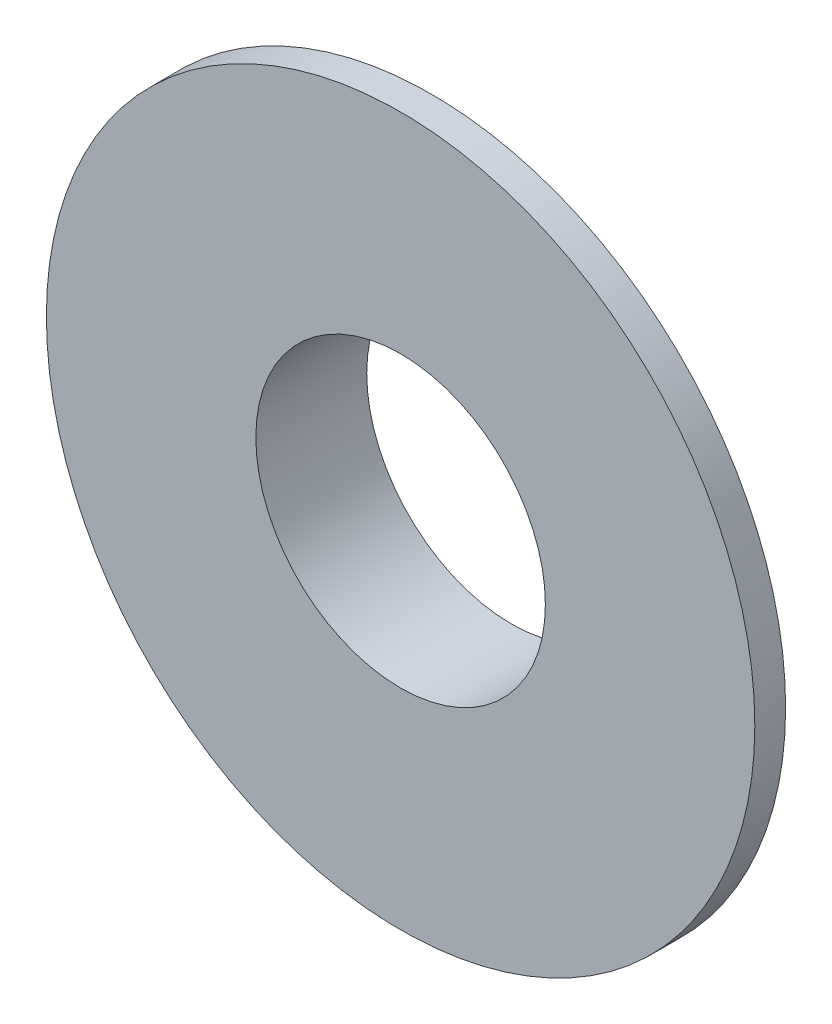
ISO-10303-21;
HEADER;
FILE_DESCRIPTION(('STEP AP214'),'2;1');
FILE_NAME('part.step','',(''),(''),'','','');
FILE_SCHEMA(('AUTOMOTIVE_DESIGN { 1 0 10303 214 1 1 1 1 }'));
ENDSEC;
DATA;
#1=APPLICATION_CONTEXT('core data for automotive mechanical design processes');
#2=APPLICATION_PROTOCOL_DEFINITION('international standard','automotive_design',2000,#1);
#3=PRODUCT_CONTEXT('',#1,'mechanical');
#4=PRODUCT('Part','Part','',(#3));
#5=PRODUCT_RELATED_PRODUCT_CATEGORY('part','',(#4));
#6=PRODUCT_DEFINITION_FORMATION('','',#4);
#7=PRODUCT_DEFINITION_CONTEXT('part definition',#1,'design');
#8=PRODUCT_DEFINITION('design','',#6,#7);
#9=PRODUCT_DEFINITION_SHAPE('','',#8);
#10=(LENGTH_UNIT() NAMED_UNIT(*) SI_UNIT(.MILLI.,.METRE.));
#11=(NAMED_UNIT(*) PLANE_ANGLE_UNIT() SI_UNIT($,.RADIAN.));
#12=(NAMED_UNIT(*) SI_UNIT($,.STERADIAN.) SOLID_ANGLE_UNIT());
#13=UNCERTAINTY_MEASURE_WITH_UNIT(LENGTH_MEASURE(1.E-05),#10,'distance_accuracy_value','');
#14=(GEOMETRIC_REPRESENTATION_CONTEXT(3) GLOBAL_UNCERTAINTY_ASSIGNED_CONTEXT((#13)) GLOBAL_UNIT_ASSIGNED_CONTEXT((#10,
#11,#12)) REPRESENTATION_CONTEXT('',''));
#15=CARTESIAN_POINT('',(0.,0.,0.));
#16=DIRECTION('',(0.,0.,1.));
#17=DIRECTION('',(1.,0.,0.));
#18=AXIS2_PLACEMENT_3D('',#15,#16,#17);
#19=CARTESIAN_POINT('',(0.,23.5,18.));
#20=DIRECTION('',(0.,0.,1.));
#21=DIRECTION('',(1.,0.,0.));
#22=AXIS2_PLACEMENT_3D('',#19,#20,#21);
#23=PLANE('',#22);
#24=CARTESIAN_POINT('',(0.,0.,18.));
#25=DIRECTION('',(0.,0.,-1.));
#26=DIRECTION('',(-1.,0.,0.));
#27=AXIS2_PLACEMENT_3D('',#24,#25,#26);
#28=CIRCLE('',#27,23.5);
#29=CARTESIAN_POINT('',(-23.5,0.,18.));
#30=VERTEX_POINT('',#29);
#31=EDGE_CURVE('E59',#30,#30,#28,.T.);
#32=ORIENTED_EDGE('',*,*,#31,.T.);
#33=EDGE_LOOP('',(#32));
#34=FACE_BOUND('',#33,.T.);
#35=CARTESIAN_POINT('',(0.,0.,18.));
#36=DIRECTION('',(0.,0.,-1.));
#37=DIRECTION('',(-1.,0.,0.));
#38=AXIS2_PLACEMENT_3D('',#35,#36,#37);
#39=CIRCLE('',#38,57.5);
#40=CARTESIAN_POINT('',(-57.5,0.,18.));
#41=VERTEX_POINT('',#40);
#42=EDGE_CURVE('E10',#41,#41,#39,.T.);
#43=ORIENTED_EDGE('',*,*,#42,.F.);
#44=EDGE_LOOP('',(#43));
#45=FACE_BOUND('',#44,.T.);
#46=ADVANCED_FACE('F37',(#34,#45),#23,.T.);
#47=CARTESIAN_POINT('',(0.,0.,0.));
#48=DIRECTION('',(0.,0.,-1.));
#49=DIRECTION('',(-1.,0.,0.));
#50=AXIS2_PLACEMENT_3D('',#47,#48,#49);
#51=CYLINDRICAL_SURFACE('',#50,57.5);
#52=ORIENTED_EDGE('',*,*,#42,.T.);
#53=EDGE_LOOP('',(#52));
#54=FACE_BOUND('',#53,.T.);
#55=CARTESIAN_POINT('',(0.,0.,13.));
#56=DIRECTION('',(0.,0.,-1.));
#57=DIRECTION('',(-1.,0.,0.));
#58=AXIS2_PLACEMENT_3D('',#55,#56,#57);
#59=CIRCLE('',#58,57.5);
#60=CARTESIAN_POINT('',(-57.5,0.,13.));
#61=VERTEX_POINT('',#60);
#62=EDGE_CURVE('E43',#61,#61,#59,.T.);
#63=ORIENTED_EDGE('',*,*,#62,.F.);
#64=EDGE_LOOP('',(#63));
#65=FACE_BOUND('',#64,.T.);
#66=ADVANCED_FACE('F77',(#54,#65),#51,.T.);
#67=CARTESIAN_POINT('',(0.,57.5,13.));
#68=DIRECTION('',(0.,0.,-1.));
#69=DIRECTION('',(-1.,0.,0.));
#70=AXIS2_PLACEMENT_3D('',#67,#68,#69);
#71=PLANE('',#70);
#72=ORIENTED_EDGE('',*,*,#62,.T.);
#73=EDGE_LOOP('',(#72));
#74=FACE_BOUND('',#73,.T.);
#75=CARTESIAN_POINT('',(0.,0.,13.));
#76=DIRECTION('',(0.,0.,-1.));
#77=DIRECTION('',(-1.,0.,0.));
#78=AXIS2_PLACEMENT_3D('',#75,#76,#77);
#79=CIRCLE('',#78,29.25);
#80=CARTESIAN_POINT('',(-29.25,0.,13.));
#81=VERTEX_POINT('',#80);
#82=EDGE_CURVE('E47',#81,#81,#79,.T.);
#83=ORIENTED_EDGE('',*,*,#82,.F.);
#84=EDGE_LOOP('',(#83));
#85=FACE_BOUND('',#84,.T.);
#86=ADVANCED_FACE('F81',(#74,#85),#71,.T.);
#87=CARTESIAN_POINT('',(0.,0.,0.));
#88=DIRECTION('',(0.,0.,-1.));
#89=DIRECTION('',(-1.,0.,0.));
#90=AXIS2_PLACEMENT_3D('',#87,#88,#89);
#91=CYLINDRICAL_SURFACE('',#90,29.25);
#92=ORIENTED_EDGE('',*,*,#82,.T.);
#93=EDGE_LOOP('',(#92));
#94=FACE_BOUND('',#93,.T.);
#95=CARTESIAN_POINT('',(0.,0.,0.));
#96=DIRECTION('',(0.,0.,-1.));
#97=DIRECTION('',(-1.,0.,0.));
#98=AXIS2_PLACEMENT_3D('',#95,#96,#97);
#99=CIRCLE('',#98,29.25);
#100=CARTESIAN_POINT('',(-29.25,0.,0.));
#101=VERTEX_POINT('',#100);
#102=EDGE_CURVE('E51',#101,#101,#99,.T.);
#103=ORIENTED_EDGE('',*,*,#102,.F.);
#104=EDGE_LOOP('',(#103));
#105=FACE_BOUND('',#104,.T.);
#106=ADVANCED_FACE('F73',(#94,#105),#91,.T.);
#107=CARTESIAN_POINT('',(0.,29.25,0.));
#108=DIRECTION('',(0.,0.,-1.));
#109=DIRECTION('',(-1.,0.,0.));
#110=AXIS2_PLACEMENT_3D('',#107,#108,#109);
#111=PLANE('',#110);
#112=ORIENTED_EDGE('',*,*,#102,.T.);
#113=EDGE_LOOP('',(#112));
#114=FACE_BOUND('',#113,.T.);
#115=CARTESIAN_POINT('',(0.,0.,0.));
#116=DIRECTION('',(0.,0.,-1.));
#117=DIRECTION('',(-1.,0.,0.));
#118=AXIS2_PLACEMENT_3D('',#115,#116,#117);
#119=CIRCLE('',#118,23.5);
#120=CARTESIAN_POINT('',(-23.5,0.,0.));
#121=VERTEX_POINT('',#120);
#122=EDGE_CURVE('E56',#121,#121,#119,.T.);
#123=ORIENTED_EDGE('',*,*,#122,.F.);
#124=EDGE_LOOP('',(#123));
#125=FACE_BOUND('',#124,.T.);
#126=ADVANCED_FACE('F67',(#114,#125),#111,.T.);
#127=CARTESIAN_POINT('',(0.,0.,0.));
#128=DIRECTION('',(0.,0.,-1.));
#129=DIRECTION('',(-1.,0.,0.));
#130=AXIS2_PLACEMENT_3D('',#127,#128,#129);
#131=CYLINDRICAL_SURFACE('',#130,23.5);
#132=ORIENTED_EDGE('',*,*,#122,.T.);
#133=EDGE_LOOP('',(#132));
#134=FACE_BOUND('',#133,.T.);
#135=ORIENTED_EDGE('',*,*,#31,.F.);
#136=EDGE_LOOP('',(#135));
#137=FACE_BOUND('',#136,.T.);
#138=ADVANCED_FACE('F65',(#134,#137),#131,.F.);
#139=CLOSED_SHELL('',(#46,#66,#86,#106,#126,#138));
#140=MANIFOLD_SOLID_BREP('B2',#139);
#141=ADVANCED_BREP_SHAPE_REPRESENTATION('',(#18,#140),#14);
#142=SHAPE_DEFINITION_REPRESENTATION(#9,#141);
ENDSEC;
END-ISO-10303-21;
